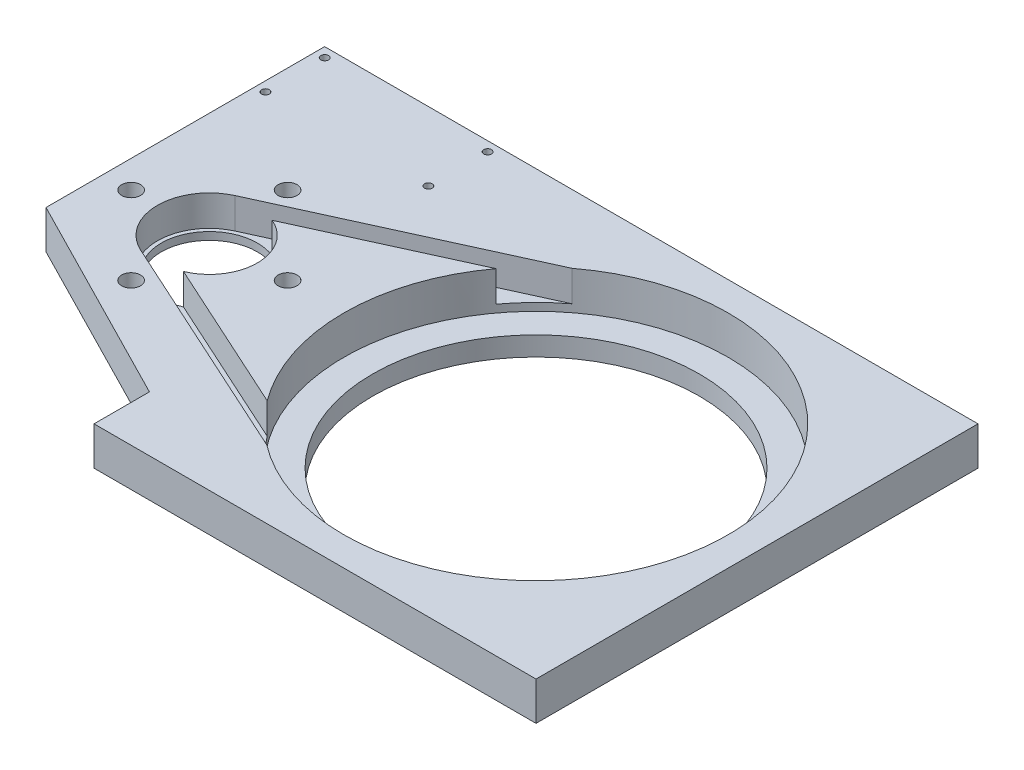
ISO-10303-21;
HEADER;
FILE_DESCRIPTION(('STEP AP214'),'2;1');
FILE_NAME('part.step','',(''),(''),'','','');
FILE_SCHEMA(('AUTOMOTIVE_DESIGN { 1 0 10303 214 1 1 1 1 }'));
ENDSEC;
DATA;
#1=APPLICATION_CONTEXT('core data for automotive mechanical design processes');
#2=APPLICATION_PROTOCOL_DEFINITION('international standard','automotive_design',2000,#1);
#3=PRODUCT_CONTEXT('',#1,'mechanical');
#4=PRODUCT('Part','Part','',(#3));
#5=PRODUCT_RELATED_PRODUCT_CATEGORY('part','',(#4));
#6=PRODUCT_DEFINITION_FORMATION('','',#4);
#7=PRODUCT_DEFINITION_CONTEXT('part definition',#1,'design');
#8=PRODUCT_DEFINITION('design','',#6,#7);
#9=PRODUCT_DEFINITION_SHAPE('','',#8);
#10=(LENGTH_UNIT() NAMED_UNIT(*) SI_UNIT(.MILLI.,.METRE.));
#11=(NAMED_UNIT(*) PLANE_ANGLE_UNIT() SI_UNIT($,.RADIAN.));
#12=(NAMED_UNIT(*) SI_UNIT($,.STERADIAN.) SOLID_ANGLE_UNIT());
#13=UNCERTAINTY_MEASURE_WITH_UNIT(LENGTH_MEASURE(1.E-05),#10,'distance_accuracy_value','');
#14=(GEOMETRIC_REPRESENTATION_CONTEXT(3) GLOBAL_UNCERTAINTY_ASSIGNED_CONTEXT((#13)) GLOBAL_UNIT_ASSIGNED_CONTEXT((#10,
#11,#12)) REPRESENTATION_CONTEXT('',''));
#15=CARTESIAN_POINT('',(0.,0.,0.));
#16=DIRECTION('',(0.,0.,1.));
#17=DIRECTION('',(1.,0.,0.));
#18=AXIS2_PLACEMENT_3D('',#15,#16,#17);
#19=CARTESIAN_POINT('',(-57.5,15.,57.5));
#20=DIRECTION('',(1.,0.,0.));
#21=DIRECTION('',(0.,0.,-1.));
#22=AXIS2_PLACEMENT_3D('',#19,#20,#21);
#23=PLANE('',#22);
#24=DIRECTION('',(0.,0.,-1.));
#25=VECTOR('',#24,1.);
#26=CARTESIAN_POINT('',(-57.5,13.,-43.0904352461679));
#27=LINE('',#26,#25);
#28=CARTESIAN_POINT('',(-57.5,13.,-43.0904352461679));
#29=VERTEX_POINT('',#28);
#30=CARTESIAN_POINT('',(-57.5,13.,-57.5));
#31=VERTEX_POINT('',#30);
#32=EDGE_CURVE('E313',#29,#31,#27,.T.);
#33=ORIENTED_EDGE('',*,*,#32,.T.);
#34=DIRECTION('',(0.,-1.,0.));
#35=VECTOR('',#34,1.);
#36=CARTESIAN_POINT('',(-57.5,15.,-57.5));
#37=LINE('',#36,#35);
#38=CARTESIAN_POINT('',(-57.5,5.,-57.5));
#39=VERTEX_POINT('',#38);
#40=EDGE_CURVE('E188',#31,#39,#37,.T.);
#41=ORIENTED_EDGE('',*,*,#40,.T.);
#42=DIRECTION('',(0.,0.,1.));
#43=VECTOR('',#42,1.);
#44=CARTESIAN_POINT('',(-57.5,5.,57.5));
#45=LINE('',#44,#43);
#46=CARTESIAN_POINT('',(-57.5,5.,-43.0904352461679));
#47=VERTEX_POINT('',#46);
#48=EDGE_CURVE('E189',#39,#47,#45,.T.);
#49=ORIENTED_EDGE('',*,*,#48,.T.);
#50=DIRECTION('',(0.,1.,0.));
#51=VECTOR('',#50,1.);
#52=CARTESIAN_POINT('',(-57.5,-97.2357199750497,-43.0904352461679));
#53=LINE('',#52,#51);
#54=EDGE_CURVE('E323',#47,#29,#53,.T.);
#55=ORIENTED_EDGE('',*,*,#54,.T.);
#56=EDGE_LOOP('',(#33,#41,#49,#55));
#57=FACE_BOUND('',#56,.T.);
#58=ADVANCED_FACE('F41',(#57),#23,.F.);
#59=CARTESIAN_POINT('',(-57.5,-97.2357199750497,-43.0904352461679));
#60=DIRECTION('',(-0.454845595302126,0.,-0.890570314143838));
#61=DIRECTION('',(-0.890570314143838,0.,0.454845595302126));
#62=AXIS2_PLACEMENT_3D('',#59,#60,#61);
#63=PLANE('',#62);
#64=DIRECTION('',(0.,1.,0.));
#65=VECTOR('',#64,1.);
#66=CARTESIAN_POINT('',(-112.5,-97.2357199750497,-15.));
#67=LINE('',#66,#65);
#68=CARTESIAN_POINT('',(-112.5,5.,-15.));
#69=VERTEX_POINT('',#68);
#70=CARTESIAN_POINT('',(-112.5,13.,-15.));
#71=VERTEX_POINT('',#70);
#72=EDGE_CURVE('E162',#69,#71,#67,.T.);
#73=ORIENTED_EDGE('',*,*,#72,.T.);
#74=DIRECTION('',(0.890570314143838,0.,-0.454845595302126));
#75=VECTOR('',#74,1.);
#76=CARTESIAN_POINT('',(-112.5,13.,-15.));
#77=LINE('',#76,#75);
#78=EDGE_CURVE('E340',#71,#29,#77,.T.);
#79=ORIENTED_EDGE('',*,*,#78,.T.);
#80=ORIENTED_EDGE('',*,*,#54,.F.);
#81=DIRECTION('',(-0.890570314143838,0.,0.454845595302126));
#82=VECTOR('',#81,1.);
#83=CARTESIAN_POINT('',(-57.5,5.,-43.0904352461679));
#84=LINE('',#83,#82);
#85=EDGE_CURVE('E166',#47,#69,#84,.T.);
#86=ORIENTED_EDGE('',*,*,#85,.T.);
#87=EDGE_LOOP('',(#73,#79,#80,#86));
#88=FACE_BOUND('',#87,.T.);
#89=ADVANCED_FACE('F339',(#88),#63,.T.);
#90=CARTESIAN_POINT('',(0.,15.,0.));
#91=DIRECTION('',(0.,-1.,0.));
#92=DIRECTION('',(0.,0.,-1.));
#93=AXIS2_PLACEMENT_3D('',#90,#91,#92);
#94=PLANE('',#93);
#95=CARTESIAN_POINT('',(0.,15.,0.));
#96=DIRECTION('',(0.,1.,0.));
#97=DIRECTION('',(0.,0.,1.));
#98=AXIS2_PLACEMENT_3D('',#95,#96,#97);
#99=CIRCLE('',#98,50.);
#100=CARTESIAN_POINT('',(-40.1698982158662,15.,-29.7721224860934));
#101=VERTEX_POINT('',#100);
#102=CARTESIAN_POINT('',(-40.1698982158662,15.,29.7721224860934));
#103=VERTEX_POINT('',#102);
#104=EDGE_CURVE('E161',#101,#103,#99,.T.);
#105=ORIENTED_EDGE('',*,*,#104,.F.);
#106=DIRECTION('',(0.909955510528877,0.,-0.414705882352941));
#107=VECTOR('',#106,1.);
#108=CARTESIAN_POINT('',(-18.1433823529412,15.,-39.8105535856384));
#109=LINE('',#108,#107);
#110=CARTESIAN_POINT('',(-80.1851199879185,15.,-11.5354640335471));
#111=VERTEX_POINT('',#110);
#112=EDGE_CURVE('E402',#111,#101,#109,.T.);
#113=ORIENTED_EDGE('',*,*,#112,.F.);
#114=CARTESIAN_POINT('',(-85.,15.,0.));
#115=DIRECTION('',(0.,1.,0.));
#116=DIRECTION('',(0.,0.,1.));
#117=AXIS2_PLACEMENT_3D('',#114,#115,#116);
#118=CIRCLE('',#117,12.5);
#119=CARTESIAN_POINT('',(-80.1851199879185,15.,11.5354640335471));
#120=VERTEX_POINT('',#119);
#121=EDGE_CURVE('E362',#120,#111,#118,.T.);
#122=ORIENTED_EDGE('',*,*,#121,.F.);
#123=DIRECTION('',(-0.909955510528877,0.,-0.414705882352941));
#124=VECTOR('',#123,1.);
#125=CARTESIAN_POINT('',(-18.1433823529412,15.,39.8105535856384));
#126=LINE('',#125,#124);
#127=EDGE_CURVE('E405',#103,#120,#126,.T.);
#128=ORIENTED_EDGE('',*,*,#127,.F.);
#129=EDGE_LOOP('',(#105,#113,#122,#128));
#130=FACE_BOUND('',#129,.T.);
#131=CARTESIAN_POINT('',(-64.6423957696393,15.,0.));
#132=DIRECTION('',(0.,-1.,0.));
#133=DIRECTION('',(0.,0.,-1.));
#134=AXIS2_PLACEMENT_3D('',#131,#132,#133);
#135=CIRCLE('',#134,2.45745);
#136=CARTESIAN_POINT('',(-64.6423957696393,15.,-2.45745));
#137=VERTEX_POINT('',#136);
#138=EDGE_CURVE('E383',#137,#137,#135,.T.);
#139=ORIENTED_EDGE('',*,*,#138,.T.);
#140=EDGE_LOOP('',(#139));
#141=FACE_BOUND('',#140,.T.);
#142=ADVANCED_FACE('F463',(#130,#141),#94,.F.);
#143=DIRECTION('',(0.,1.,0.));
#144=VECTOR('',#143,1.);
#145=CARTESIAN_POINT('',(-57.5,-97.2357199750497,43.0904352461679));
#146=LINE('',#145,#144);
#147=CARTESIAN_POINT('',(-57.5,5.,43.0904352461679));
#148=VERTEX_POINT('',#147);
#149=CARTESIAN_POINT('',(-57.5,15.,43.0904352461679));
#150=VERTEX_POINT('',#149);
#151=EDGE_CURVE('E341',#148,#150,#146,.T.);
#152=ORIENTED_EDGE('',*,*,#151,.F.);
#153=CARTESIAN_POINT('',(-57.5,5.,57.5));
#154=VERTEX_POINT('',#153);
#155=EDGE_CURVE('E174',#148,#154,#45,.T.);
#156=ORIENTED_EDGE('',*,*,#155,.T.);
#157=DIRECTION('',(0.,-1.,0.));
#158=VECTOR('',#157,1.);
#159=CARTESIAN_POINT('',(-57.5,15.,57.5));
#160=LINE('',#159,#158);
#161=CARTESIAN_POINT('',(-57.5,15.,57.5));
#162=VERTEX_POINT('',#161);
#163=EDGE_CURVE('E208',#162,#154,#160,.T.);
#164=ORIENTED_EDGE('',*,*,#163,.F.);
#165=DIRECTION('',(0.,0.,1.));
#166=VECTOR('',#165,1.);
#167=CARTESIAN_POINT('',(-57.5,15.,57.5));
#168=LINE('',#167,#166);
#169=EDGE_CURVE('E175',#150,#162,#168,.T.);
#170=ORIENTED_EDGE('',*,*,#169,.F.);
#171=EDGE_LOOP('',(#152,#156,#164,#170));
#172=FACE_BOUND('',#171,.T.);
#173=ADVANCED_FACE('F486',(#172),#23,.F.);
#174=CARTESIAN_POINT('',(-52.5,5.,52.5));
#175=DIRECTION('',(-1.,0.,0.));
#176=DIRECTION('',(0.,0.,1.));
#177=AXIS2_PLACEMENT_3D('',#174,#175,#176);
#178=PLANE('',#177);
#179=DIRECTION('',(0.,0.,-1.));
#180=VECTOR('',#179,1.);
#181=CARTESIAN_POINT('',(-52.5,0.,52.5));
#182=LINE('',#181,#180);
#183=CARTESIAN_POINT('',(-52.5,0.,52.5));
#184=VERTEX_POINT('',#183);
#185=CARTESIAN_POINT('',(-52.5,0.,-52.5));
#186=VERTEX_POINT('',#185);
#187=EDGE_CURVE('E108',#184,#186,#182,.T.);
#188=ORIENTED_EDGE('',*,*,#187,.F.);
#189=DIRECTION('',(0.,-1.,0.));
#190=VECTOR('',#189,1.);
#191=CARTESIAN_POINT('',(-52.5,5.,52.5));
#192=LINE('',#191,#190);
#193=CARTESIAN_POINT('',(-52.5,5.,52.5));
#194=VERTEX_POINT('',#193);
#195=EDGE_CURVE('E90',#194,#184,#192,.T.);
#196=ORIENTED_EDGE('',*,*,#195,.F.);
#197=DIRECTION('',(0.,0.,-1.));
#198=VECTOR('',#197,1.);
#199=CARTESIAN_POINT('',(-52.5,5.,52.5));
#200=LINE('',#199,#198);
#201=CARTESIAN_POINT('',(-52.5,5.,-52.5));
#202=VERTEX_POINT('',#201);
#203=EDGE_CURVE('E95',#194,#202,#200,.T.);
#204=ORIENTED_EDGE('',*,*,#203,.T.);
#205=DIRECTION('',(0.,-1.,0.));
#206=VECTOR('',#205,1.);
#207=CARTESIAN_POINT('',(-52.5,5.,-52.5));
#208=LINE('',#207,#206);
#209=EDGE_CURVE('E115',#202,#186,#208,.T.);
#210=ORIENTED_EDGE('',*,*,#209,.T.);
#211=EDGE_LOOP('',(#188,#196,#204,#210));
#212=FACE_BOUND('',#211,.T.);
#213=ADVANCED_FACE('F43',(#212),#178,.T.);
#214=CARTESIAN_POINT('',(-52.5,5.,52.5));
#215=DIRECTION('',(0.,0.,-1.));
#216=DIRECTION('',(-1.,0.,0.));
#217=AXIS2_PLACEMENT_3D('',#214,#215,#216);
#218=PLANE('',#217);
#219=DIRECTION('',(1.,0.,0.));
#220=VECTOR('',#219,1.);
#221=CARTESIAN_POINT('',(-52.5,0.,52.5));
#222=LINE('',#221,#220);
#223=CARTESIAN_POINT('',(52.5,0.,52.5));
#224=VERTEX_POINT('',#223);
#225=EDGE_CURVE('E83',#184,#224,#222,.T.);
#226=ORIENTED_EDGE('',*,*,#225,.T.);
#227=DIRECTION('',(0.,-1.,0.));
#228=VECTOR('',#227,1.);
#229=CARTESIAN_POINT('',(52.5,5.,52.5));
#230=LINE('',#229,#228);
#231=CARTESIAN_POINT('',(52.5,5.,52.5));
#232=VERTEX_POINT('',#231);
#233=EDGE_CURVE('E88',#232,#224,#230,.T.);
#234=ORIENTED_EDGE('',*,*,#233,.F.);
#235=DIRECTION('',(1.,0.,0.));
#236=VECTOR('',#235,1.);
#237=CARTESIAN_POINT('',(-52.5,5.,52.5));
#238=LINE('',#237,#236);
#239=EDGE_CURVE('E117',#194,#232,#238,.T.);
#240=ORIENTED_EDGE('',*,*,#239,.F.);
#241=ORIENTED_EDGE('',*,*,#195,.T.);
#242=EDGE_LOOP('',(#226,#234,#240,#241));
#243=FACE_BOUND('',#242,.T.);
#244=ADVANCED_FACE('F85',(#243),#218,.F.);
#245=CARTESIAN_POINT('',(52.5,5.,52.5));
#246=DIRECTION('',(-1.,0.,0.));
#247=DIRECTION('',(0.,0.,1.));
#248=AXIS2_PLACEMENT_3D('',#245,#246,#247);
#249=PLANE('',#248);
#250=DIRECTION('',(0.,0.,-1.));
#251=VECTOR('',#250,1.);
#252=CARTESIAN_POINT('',(52.5,0.,52.5));
#253=LINE('',#252,#251);
#254=CARTESIAN_POINT('',(52.5,0.,-52.5));
#255=VERTEX_POINT('',#254);
#256=EDGE_CURVE('E96',#224,#255,#253,.T.);
#257=ORIENTED_EDGE('',*,*,#256,.T.);
#258=DIRECTION('',(0.,-1.,0.));
#259=VECTOR('',#258,1.);
#260=CARTESIAN_POINT('',(52.5,5.,-52.5));
#261=LINE('',#260,#259);
#262=CARTESIAN_POINT('',(52.5,5.,-52.5));
#263=VERTEX_POINT('',#262);
#264=EDGE_CURVE('E102',#263,#255,#261,.T.);
#265=ORIENTED_EDGE('',*,*,#264,.F.);
#266=DIRECTION('',(0.,0.,-1.));
#267=VECTOR('',#266,1.);
#268=CARTESIAN_POINT('',(52.5,5.,52.5));
#269=LINE('',#268,#267);
#270=EDGE_CURVE('E65',#232,#263,#269,.T.);
#271=ORIENTED_EDGE('',*,*,#270,.F.);
#272=ORIENTED_EDGE('',*,*,#233,.T.);
#273=EDGE_LOOP('',(#257,#265,#271,#272));
#274=FACE_BOUND('',#273,.T.);
#275=ADVANCED_FACE('F100',(#274),#249,.F.);
#276=CARTESIAN_POINT('',(-52.5,5.,-52.5));
#277=DIRECTION('',(0.,0.,-1.));
#278=DIRECTION('',(-1.,0.,0.));
#279=AXIS2_PLACEMENT_3D('',#276,#277,#278);
#280=PLANE('',#279);
#281=DIRECTION('',(1.,0.,0.));
#282=VECTOR('',#281,1.);
#283=CARTESIAN_POINT('',(-52.5,0.,-52.5));
#284=LINE('',#283,#282);
#285=EDGE_CURVE('E106',#186,#255,#284,.T.);
#286=ORIENTED_EDGE('',*,*,#285,.F.);
#287=ORIENTED_EDGE('',*,*,#209,.F.);
#288=DIRECTION('',(1.,0.,0.));
#289=VECTOR('',#288,1.);
#290=CARTESIAN_POINT('',(-52.5,5.,-52.5));
#291=LINE('',#290,#289);
#292=EDGE_CURVE('E213',#202,#263,#291,.T.);
#293=ORIENTED_EDGE('',*,*,#292,.T.);
#294=ORIENTED_EDGE('',*,*,#264,.T.);
#295=EDGE_LOOP('',(#286,#287,#293,#294));
#296=FACE_BOUND('',#295,.T.);
#297=ADVANCED_FACE('F222',(#296),#280,.T.);
#298=CARTESIAN_POINT('',(0.,0.,0.));
#299=DIRECTION('',(0.,-1.,0.));
#300=DIRECTION('',(0.,0.,-1.));
#301=AXIS2_PLACEMENT_3D('',#298,#299,#300);
#302=PLANE('',#301);
#303=CARTESIAN_POINT('',(0.,0.,0.));
#304=DIRECTION('',(0.,1.,0.));
#305=DIRECTION('',(0.,0.,1.));
#306=AXIS2_PLACEMENT_3D('',#303,#304,#305);
#307=CIRCLE('',#306,42.5);
#308=CARTESIAN_POINT('',(0.,0.,42.5));
#309=VERTEX_POINT('',#308);
#310=EDGE_CURVE('E121',#309,#309,#307,.T.);
#311=ORIENTED_EDGE('',*,*,#310,.T.);
#312=EDGE_LOOP('',(#311));
#313=FACE_BOUND('',#312,.T.);
#314=ORIENTED_EDGE('',*,*,#187,.T.);
#315=ORIENTED_EDGE('',*,*,#285,.T.);
#316=ORIENTED_EDGE('',*,*,#256,.F.);
#317=ORIENTED_EDGE('',*,*,#225,.F.);
#318=EDGE_LOOP('',(#314,#315,#316,#317));
#319=FACE_BOUND('',#318,.T.);
#320=ADVANCED_FACE('F104',(#313,#319),#302,.T.);
#321=CARTESIAN_POINT('',(0.,5.,0.));
#322=DIRECTION('',(0.,-1.,0.));
#323=DIRECTION('',(0.,0.,-1.));
#324=AXIS2_PLACEMENT_3D('',#321,#322,#323);
#325=PLANE('',#324);
#326=CARTESIAN_POINT('',(-64.6423957696393,5.,0.));
#327=DIRECTION('',(0.,-1.,0.));
#328=DIRECTION('',(0.,0.,-1.));
#329=AXIS2_PLACEMENT_3D('',#326,#327,#328);
#330=CIRCLE('',#329,2.45745);
#331=CARTESIAN_POINT('',(-64.6423957696393,5.,-2.45745));
#332=VERTEX_POINT('',#331);
#333=EDGE_CURVE('E386',#332,#332,#330,.T.);
#334=ORIENTED_EDGE('',*,*,#333,.F.);
#335=EDGE_LOOP('',(#334));
#336=FACE_BOUND('',#335,.T.);
#337=CARTESIAN_POINT('',(-85.,5.,20.3576042303607));
#338=DIRECTION('',(0.,-1.,0.));
#339=DIRECTION('',(0.,0.,-1.));
#340=AXIS2_PLACEMENT_3D('',#337,#338,#339);
#341=CIRCLE('',#340,2.45745);
#342=CARTESIAN_POINT('',(-85.,5.,17.9001542303607));
#343=VERTEX_POINT('',#342);
#344=EDGE_CURVE('E380',#343,#343,#341,.T.);
#345=ORIENTED_EDGE('',*,*,#344,.F.);
#346=EDGE_LOOP('',(#345));
#347=FACE_BOUND('',#346,.T.);
#348=CARTESIAN_POINT('',(-105.357604230361,5.,0.));
#349=DIRECTION('',(0.,-1.,0.));
#350=DIRECTION('',(0.,0.,-1.));
#351=AXIS2_PLACEMENT_3D('',#348,#349,#350);
#352=CIRCLE('',#351,2.45745);
#353=CARTESIAN_POINT('',(-105.357604230361,5.,-2.45745000000001));
#354=VERTEX_POINT('',#353);
#355=EDGE_CURVE('E374',#354,#354,#352,.T.);
#356=ORIENTED_EDGE('',*,*,#355,.F.);
#357=EDGE_LOOP('',(#356));
#358=FACE_BOUND('',#357,.T.);
#359=CARTESIAN_POINT('',(-85.,5.,-20.3576042303607));
#360=DIRECTION('',(0.,-1.,0.));
#361=DIRECTION('',(0.,0.,-1.));
#362=AXIS2_PLACEMENT_3D('',#359,#360,#361);
#363=CIRCLE('',#362,2.45745);
#364=CARTESIAN_POINT('',(-85.,5.,-22.8150542303607));
#365=VERTEX_POINT('',#364);
#366=EDGE_CURVE('E368',#365,#365,#363,.T.);
#367=ORIENTED_EDGE('',*,*,#366,.F.);
#368=EDGE_LOOP('',(#367));
#369=FACE_BOUND('',#368,.T.);
#370=CARTESIAN_POINT('',(-85.,5.,0.));
#371=DIRECTION('',(0.,-1.,0.));
#372=DIRECTION('',(0.,0.,-1.));
#373=AXIS2_PLACEMENT_3D('',#370,#371,#372);
#374=CIRCLE('',#373,12.5);
#375=CARTESIAN_POINT('',(-85.,5.,-12.5));
#376=VERTEX_POINT('',#375);
#377=EDGE_CURVE('E358',#376,#376,#374,.T.);
#378=ORIENTED_EDGE('',*,*,#377,.F.);
#379=EDGE_LOOP('',(#378));
#380=FACE_BOUND('',#379,.T.);
#381=ORIENTED_EDGE('',*,*,#48,.F.);
#382=DIRECTION('',(-1.,0.,0.));
#383=VECTOR('',#382,1.);
#384=CARTESIAN_POINT('',(-57.5,5.,-57.5));
#385=LINE('',#384,#383);
#386=CARTESIAN_POINT('',(57.5,5.,-57.5));
#387=VERTEX_POINT('',#386);
#388=EDGE_CURVE('E179',#387,#39,#385,.T.);
#389=ORIENTED_EDGE('',*,*,#388,.F.);
#390=DIRECTION('',(0.,0.,-1.));
#391=VECTOR('',#390,1.);
#392=CARTESIAN_POINT('',(57.5,5.,57.5));
#393=LINE('',#392,#391);
#394=CARTESIAN_POINT('',(57.5,5.,57.5));
#395=VERTEX_POINT('',#394);
#396=EDGE_CURVE('E195',#395,#387,#393,.T.);
#397=ORIENTED_EDGE('',*,*,#396,.F.);
#398=DIRECTION('',(1.,0.,0.));
#399=VECTOR('',#398,1.);
#400=CARTESIAN_POINT('',(-57.5,5.,57.5));
#401=LINE('',#400,#399);
#402=EDGE_CURVE('E192',#154,#395,#401,.T.);
#403=ORIENTED_EDGE('',*,*,#402,.F.);
#404=ORIENTED_EDGE('',*,*,#155,.F.);
#405=DIRECTION('',(0.890570314143838,0.,0.454845595302126));
#406=VECTOR('',#405,1.);
#407=CARTESIAN_POINT('',(-112.5,5.,15.));
#408=LINE('',#407,#406);
#409=CARTESIAN_POINT('',(-112.5,5.,15.));
#410=VERTEX_POINT('',#409);
#411=EDGE_CURVE('E343',#410,#148,#408,.T.);
#412=ORIENTED_EDGE('',*,*,#411,.F.);
#413=DIRECTION('',(0.,0.,1.));
#414=VECTOR('',#413,1.);
#415=CARTESIAN_POINT('',(-112.5,5.,-15.));
#416=LINE('',#415,#414);
#417=EDGE_CURVE('E335',#69,#410,#416,.T.);
#418=ORIENTED_EDGE('',*,*,#417,.F.);
#419=ORIENTED_EDGE('',*,*,#85,.F.);
#420=EDGE_LOOP('',(#381,#389,#397,#403,#404,#412,#418,#419));
#421=FACE_BOUND('',#420,.T.);
#422=ORIENTED_EDGE('',*,*,#203,.F.);
#423=ORIENTED_EDGE('',*,*,#239,.T.);
#424=ORIENTED_EDGE('',*,*,#270,.T.);
#425=ORIENTED_EDGE('',*,*,#292,.F.);
#426=EDGE_LOOP('',(#422,#423,#424,#425));
#427=FACE_BOUND('',#426,.T.);
#428=ADVANCED_FACE('F223',(#336,#347,#358,#369,#380,#421,#427),#325,.T.);
#429=CARTESIAN_POINT('',(-57.5,15.,57.5));
#430=DIRECTION('',(0.,0.,-1.));
#431=DIRECTION('',(-1.,0.,0.));
#432=AXIS2_PLACEMENT_3D('',#429,#430,#431);
#433=PLANE('',#432);
#434=ORIENTED_EDGE('',*,*,#402,.T.);
#435=DIRECTION('',(0.,-1.,0.));
#436=VECTOR('',#435,1.);
#437=CARTESIAN_POINT('',(57.5,15.,57.5));
#438=LINE('',#437,#436);
#439=CARTESIAN_POINT('',(57.5,15.,57.5));
#440=VERTEX_POINT('',#439);
#441=EDGE_CURVE('E205',#440,#395,#438,.T.);
#442=ORIENTED_EDGE('',*,*,#441,.F.);
#443=DIRECTION('',(1.,0.,0.));
#444=VECTOR('',#443,1.);
#445=CARTESIAN_POINT('',(-57.5,15.,57.5));
#446=LINE('',#445,#444);
#447=EDGE_CURVE('E178',#162,#440,#446,.T.);
#448=ORIENTED_EDGE('',*,*,#447,.F.);
#449=ORIENTED_EDGE('',*,*,#163,.T.);
#450=EDGE_LOOP('',(#434,#442,#448,#449));
#451=FACE_BOUND('',#450,.T.);
#452=ADVANCED_FACE('F513',(#451),#433,.F.);
#453=CARTESIAN_POINT('',(57.5,15.,57.5));
#454=DIRECTION('',(-1.,0.,0.));
#455=DIRECTION('',(0.,0.,1.));
#456=AXIS2_PLACEMENT_3D('',#453,#454,#455);
#457=PLANE('',#456);
#458=ORIENTED_EDGE('',*,*,#396,.T.);
#459=DIRECTION('',(0.,-1.,0.));
#460=VECTOR('',#459,1.);
#461=CARTESIAN_POINT('',(57.5,15.,-57.5));
#462=LINE('',#461,#460);
#463=CARTESIAN_POINT('',(57.5,15.,-57.5));
#464=VERTEX_POINT('',#463);
#465=EDGE_CURVE('E202',#464,#387,#462,.T.);
#466=ORIENTED_EDGE('',*,*,#465,.F.);
#467=DIRECTION('',(0.,0.,-1.));
#468=VECTOR('',#467,1.);
#469=CARTESIAN_POINT('',(57.5,15.,57.5));
#470=LINE('',#469,#468);
#471=EDGE_CURVE('E182',#440,#464,#470,.T.);
#472=ORIENTED_EDGE('',*,*,#471,.F.);
#473=ORIENTED_EDGE('',*,*,#441,.T.);
#474=EDGE_LOOP('',(#458,#466,#472,#473));
#475=FACE_BOUND('',#474,.T.);
#476=ADVANCED_FACE('F542',(#475),#457,.F.);
#477=CARTESIAN_POINT('',(-57.5,15.,-57.5));
#478=DIRECTION('',(0.,0.,1.));
#479=DIRECTION('',(1.,0.,0.));
#480=AXIS2_PLACEMENT_3D('',#477,#478,#479);
#481=PLANE('',#480);
#482=ORIENTED_EDGE('',*,*,#388,.T.);
#483=ORIENTED_EDGE('',*,*,#40,.F.);
#484=DIRECTION('',(-1.,0.,0.));
#485=VECTOR('',#484,1.);
#486=CARTESIAN_POINT('',(-57.5,13.,-57.5));
#487=LINE('',#486,#485);
#488=CARTESIAN_POINT('',(-112.5,13.,-57.5));
#489=VERTEX_POINT('',#488);
#490=EDGE_CURVE('E309',#31,#489,#487,.T.);
#491=ORIENTED_EDGE('',*,*,#490,.T.);
#492=DIRECTION('',(0.,1.,0.));
#493=VECTOR('',#492,1.);
#494=CARTESIAN_POINT('',(-112.5,13.,-57.5));
#495=LINE('',#494,#493);
#496=CARTESIAN_POINT('',(-112.5,15.,-57.5));
#497=VERTEX_POINT('',#496);
#498=EDGE_CURVE('E412',#489,#497,#495,.T.);
#499=ORIENTED_EDGE('',*,*,#498,.T.);
#500=DIRECTION('',(-1.,0.,0.));
#501=VECTOR('',#500,1.);
#502=CARTESIAN_POINT('',(-57.5,15.,-57.5));
#503=LINE('',#502,#501);
#504=EDGE_CURVE('E185',#464,#497,#503,.T.);
#505=ORIENTED_EDGE('',*,*,#504,.F.);
#506=ORIENTED_EDGE('',*,*,#465,.T.);
#507=EDGE_LOOP('',(#482,#483,#491,#499,#505,#506));
#508=FACE_BOUND('',#507,.T.);
#509=ADVANCED_FACE('F326',(#508),#481,.F.);
#510=CARTESIAN_POINT('',(-85.,15.,20.3576042303607));
#511=DIRECTION('',(0.,-1.,0.));
#512=DIRECTION('',(0.,0.,-1.));
#513=AXIS2_PLACEMENT_3D('',#510,#511,#512);
#514=CIRCLE('',#513,2.45745);
#515=CARTESIAN_POINT('',(-85.,15.,17.9001542303607));
#516=VERTEX_POINT('',#515);
#517=EDGE_CURVE('E377',#516,#516,#514,.T.);
#518=ORIENTED_EDGE('',*,*,#517,.T.);
#519=EDGE_LOOP('',(#518));
#520=FACE_BOUND('',#519,.T.);
#521=CARTESIAN_POINT('',(-105.357604230361,15.,0.));
#522=DIRECTION('',(0.,-1.,0.));
#523=DIRECTION('',(0.,0.,-1.));
#524=AXIS2_PLACEMENT_3D('',#521,#522,#523);
#525=CIRCLE('',#524,2.45745);
#526=CARTESIAN_POINT('',(-105.357604230361,15.,-2.45745000000001));
#527=VERTEX_POINT('',#526);
#528=EDGE_CURVE('E371',#527,#527,#525,.T.);
#529=ORIENTED_EDGE('',*,*,#528,.T.);
#530=EDGE_LOOP('',(#529));
#531=FACE_BOUND('',#530,.T.);
#532=CARTESIAN_POINT('',(-85.,15.,-20.3576042303607));
#533=DIRECTION('',(0.,-1.,0.));
#534=DIRECTION('',(0.,0.,-1.));
#535=AXIS2_PLACEMENT_3D('',#532,#533,#534);
#536=CIRCLE('',#535,2.45745);
#537=CARTESIAN_POINT('',(-85.,15.,-22.8150542303607));
#538=VERTEX_POINT('',#537);
#539=EDGE_CURVE('E365',#538,#538,#536,.T.);
#540=ORIENTED_EDGE('',*,*,#539,.T.);
#541=EDGE_LOOP('',(#540));
#542=FACE_BOUND('',#541,.T.);
#543=CARTESIAN_POINT('',(-30.3267386255663,15.,39.752848002836));
#544=VERTEX_POINT('',#543);
#545=CARTESIAN_POINT('',(-30.3267386255663,15.,-39.7528480028361));
#546=VERTEX_POINT('',#545);
#547=EDGE_CURVE('E141',#544,#546,#99,.T.);
#548=ORIENTED_EDGE('',*,*,#547,.F.);
#549=DIRECTION('',(0.909955510528877,0.,0.414705882352941));
#550=VECTOR('',#549,1.);
#551=CARTESIAN_POINT('',(-20.2169117647059,15.,44.3603311382827));
#552=LINE('',#551,#550);
#553=CARTESIAN_POINT('',(-90.5985294117647,15.,12.2843993921398));
#554=VERTEX_POINT('',#553);
#555=EDGE_CURVE('E158',#554,#544,#552,.T.);
#556=ORIENTED_EDGE('',*,*,#555,.F.);
#557=CARTESIAN_POINT('',(-85.,15.,0.));
#558=DIRECTION('',(0.,1.,0.));
#559=DIRECTION('',(0.,0.,-1.));
#560=AXIS2_PLACEMENT_3D('',#557,#558,#559);
#561=CIRCLE('',#560,13.5);
#562=CARTESIAN_POINT('',(-90.5985294117647,15.,-12.2843993921398));
#563=VERTEX_POINT('',#562);
#564=EDGE_CURVE('E408',#563,#554,#561,.T.);
#565=ORIENTED_EDGE('',*,*,#564,.F.);
#566=DIRECTION('',(-0.909955510528877,0.,0.414705882352941));
#567=VECTOR('',#566,1.);
#568=CARTESIAN_POINT('',(-20.2169117647059,15.,-44.3603311382827));
#569=LINE('',#568,#567);
#570=EDGE_CURVE('E160',#546,#563,#569,.T.);
#571=ORIENTED_EDGE('',*,*,#570,.F.);
#572=EDGE_LOOP('',(#548,#556,#565,#571));
#573=FACE_BOUND('',#572,.T.);
#574=ORIENTED_EDGE('',*,*,#504,.T.);
#575=DIRECTION('',(0.,0.,1.));
#576=VECTOR('',#575,1.);
#577=CARTESIAN_POINT('',(-112.5,15.,-15.));
#578=LINE('',#577,#576);
#579=CARTESIAN_POINT('',(-112.5,15.,15.));
#580=VERTEX_POINT('',#579);
#581=EDGE_CURVE('E354',#497,#580,#578,.T.);
#582=ORIENTED_EDGE('',*,*,#581,.T.);
#583=DIRECTION('',(0.890570314143838,0.,0.454845595302126));
#584=VECTOR('',#583,1.);
#585=CARTESIAN_POINT('',(-112.5,15.,15.));
#586=LINE('',#585,#584);
#587=EDGE_CURVE('E351',#580,#150,#586,.T.);
#588=ORIENTED_EDGE('',*,*,#587,.T.);
#589=ORIENTED_EDGE('',*,*,#169,.T.);
#590=ORIENTED_EDGE('',*,*,#447,.T.);
#591=ORIENTED_EDGE('',*,*,#471,.T.);
#592=EDGE_LOOP('',(#574,#582,#588,#589,#590,#591));
#593=FACE_BOUND('',#592,.T.);
#594=CARTESIAN_POINT('',(-110.,15.,-39.6));
#595=DIRECTION('',(0.,1.,0.));
#596=DIRECTION('',(0.,0.,1.));
#597=AXIS2_PLACEMENT_3D('',#594,#595,#596);
#598=CIRCLE('',#597,0.999999999999998);
#599=CARTESIAN_POINT('',(-110.,15.,-38.6));
#600=VERTEX_POINT('',#599);
#601=EDGE_CURVE('E443',#600,#600,#598,.T.);
#602=ORIENTED_EDGE('',*,*,#601,.F.);
#603=EDGE_LOOP('',(#602));
#604=FACE_BOUND('',#603,.T.);
#605=CARTESIAN_POINT('',(-110.,15.,-55.));
#606=DIRECTION('',(0.,1.,0.));
#607=DIRECTION('',(0.,0.,1.));
#608=AXIS2_PLACEMENT_3D('',#605,#606,#607);
#609=CIRCLE('',#608,0.999999999999998);
#610=CARTESIAN_POINT('',(-110.,15.,-54.));
#611=VERTEX_POINT('',#610);
#612=EDGE_CURVE('E437',#611,#611,#609,.T.);
#613=ORIENTED_EDGE('',*,*,#612,.F.);
#614=EDGE_LOOP('',(#613));
#615=FACE_BOUND('',#614,.T.);
#616=CARTESIAN_POINT('',(-67.6,15.,-39.6));
#617=DIRECTION('',(0.,1.,0.));
#618=DIRECTION('',(0.,0.,1.));
#619=AXIS2_PLACEMENT_3D('',#616,#617,#618);
#620=CIRCLE('',#619,0.999999999999998);
#621=CARTESIAN_POINT('',(-67.6,15.,-38.6));
#622=VERTEX_POINT('',#621);
#623=EDGE_CURVE('E431',#622,#622,#620,.T.);
#624=ORIENTED_EDGE('',*,*,#623,.F.);
#625=EDGE_LOOP('',(#624));
#626=FACE_BOUND('',#625,.T.);
#627=CARTESIAN_POINT('',(-67.6,15.,-55.));
#628=DIRECTION('',(0.,1.,0.));
#629=DIRECTION('',(0.,0.,1.));
#630=AXIS2_PLACEMENT_3D('',#627,#628,#629);
#631=CIRCLE('',#630,0.999999999999998);
#632=CARTESIAN_POINT('',(-67.6,15.,-54.));
#633=VERTEX_POINT('',#632);
#634=EDGE_CURVE('E425',#633,#633,#631,.T.);
#635=ORIENTED_EDGE('',*,*,#634,.F.);
#636=EDGE_LOOP('',(#635));
#637=FACE_BOUND('',#636,.T.);
#638=ADVANCED_FACE('F154',(#520,#531,#542,#573,#593,#604,#615,#626,#637),#94,.F.);
#639=CARTESIAN_POINT('',(0.,0.,0.));
#640=DIRECTION('',(0.,1.,0.));
#641=DIRECTION('',(0.,0.,1.));
#642=AXIS2_PLACEMENT_3D('',#639,#640,#641);
#643=CYLINDRICAL_SURFACE('',#642,42.5);
#644=CARTESIAN_POINT('',(0.,5.,0.));
#645=DIRECTION('',(0.,-1.,0.));
#646=DIRECTION('',(0.,0.,-1.));
#647=AXIS2_PLACEMENT_3D('',#644,#645,#646);
#648=CIRCLE('',#647,42.5);
#649=CARTESIAN_POINT('',(0.,5.,-42.5));
#650=VERTEX_POINT('',#649);
#651=EDGE_CURVE('E118',#650,#650,#648,.F.);
#652=ORIENTED_EDGE('',*,*,#651,.T.);
#653=EDGE_LOOP('',(#652));
#654=FACE_BOUND('',#653,.T.);
#655=ORIENTED_EDGE('',*,*,#310,.F.);
#656=EDGE_LOOP('',(#655));
#657=FACE_BOUND('',#656,.T.);
#658=ADVANCED_FACE('F460',(#654,#657),#643,.F.);
#659=CARTESIAN_POINT('',(0.,5.,0.));
#660=DIRECTION('',(0.,-1.,0.));
#661=DIRECTION('',(0.,0.,-1.));
#662=AXIS2_PLACEMENT_3D('',#659,#660,#661);
#663=PLANE('',#662);
#664=CARTESIAN_POINT('',(0.,5.,0.));
#665=DIRECTION('',(0.,-1.,0.));
#666=DIRECTION('',(0.,0.,-1.));
#667=AXIS2_PLACEMENT_3D('',#664,#665,#666);
#668=CIRCLE('',#667,50.);
#669=CARTESIAN_POINT('',(0.,5.,-50.));
#670=VERTEX_POINT('',#669);
#671=EDGE_CURVE('E122',#670,#670,#668,.F.);
#672=ORIENTED_EDGE('',*,*,#671,.T.);
#673=EDGE_LOOP('',(#672));
#674=FACE_BOUND('',#673,.T.);
#675=ORIENTED_EDGE('',*,*,#651,.F.);
#676=EDGE_LOOP('',(#675));
#677=FACE_BOUND('',#676,.T.);
#678=ADVANCED_FACE('F530',(#674,#677),#663,.F.);
#679=CARTESIAN_POINT('',(0.,-141.42135623731,0.));
#680=DIRECTION('',(0.,1.,0.));
#681=DIRECTION('',(0.,0.,1.));
#682=AXIS2_PLACEMENT_3D('',#679,#680,#681);
#683=CYLINDRICAL_SURFACE('',#682,50.);
#684=CARTESIAN_POINT('',(0.,7.00000000000001,0.));
#685=DIRECTION('',(0.,-1.,0.));
#686=DIRECTION('',(0.,0.,-1.));
#687=AXIS2_PLACEMENT_3D('',#684,#685,#686);
#688=CIRCLE('',#687,50.);
#689=CARTESIAN_POINT('',(-30.3267386255663,7.00000000000001,-39.7528480028361));
#690=VERTEX_POINT('',#689);
#691=CARTESIAN_POINT('',(-40.1698982158662,7.00000000000001,-29.7721224860934));
#692=VERTEX_POINT('',#691);
#693=EDGE_CURVE('E394',#690,#692,#688,.F.);
#694=ORIENTED_EDGE('',*,*,#693,.T.);
#695=DIRECTION('',(0.,1.,0.));
#696=VECTOR('',#695,1.);
#697=CARTESIAN_POINT('',(-40.1698982158662,-141.42135623731,-29.7721224860934));
#698=LINE('',#697,#696);
#699=EDGE_CURVE('E389',#692,#101,#698,.T.);
#700=ORIENTED_EDGE('',*,*,#699,.T.);
#701=ORIENTED_EDGE('',*,*,#104,.T.);
#702=DIRECTION('',(0.,1.,0.));
#703=VECTOR('',#702,1.);
#704=CARTESIAN_POINT('',(-40.1698982158662,-141.42135623731,29.7721224860934));
#705=LINE('',#704,#703);
#706=CARTESIAN_POINT('',(-40.1698982158662,7.00000000000001,29.7721224860934));
#707=VERTEX_POINT('',#706);
#708=EDGE_CURVE('E392',#103,#707,#705,.F.);
#709=ORIENTED_EDGE('',*,*,#708,.T.);
#710=CARTESIAN_POINT('',(-30.3267386255663,7.00000000000001,39.752848002836));
#711=VERTEX_POINT('',#710);
#712=EDGE_CURVE('E144',#707,#711,#688,.F.);
#713=ORIENTED_EDGE('',*,*,#712,.T.);
#714=DIRECTION('',(0.,1.,0.));
#715=VECTOR('',#714,1.);
#716=CARTESIAN_POINT('',(-30.3267386255663,-141.42135623731,39.752848002836));
#717=LINE('',#716,#715);
#718=EDGE_CURVE('E49',#711,#544,#717,.T.);
#719=ORIENTED_EDGE('',*,*,#718,.T.);
#720=ORIENTED_EDGE('',*,*,#547,.T.);
#721=DIRECTION('',(0.,1.,0.));
#722=VECTOR('',#721,1.);
#723=CARTESIAN_POINT('',(-30.3267386255663,-141.42135623731,-39.7528480028361));
#724=LINE('',#723,#722);
#725=EDGE_CURVE('E12',#546,#690,#724,.F.);
#726=ORIENTED_EDGE('',*,*,#725,.T.);
#727=EDGE_LOOP('',(#694,#700,#701,#709,#713,#719,#720,#726));
#728=FACE_BOUND('',#727,.T.);
#729=ORIENTED_EDGE('',*,*,#671,.F.);
#730=EDGE_LOOP('',(#729));
#731=FACE_BOUND('',#730,.T.);
#732=ADVANCED_FACE('F138',(#728,#731),#683,.F.);
#733=CARTESIAN_POINT('',(-112.5,-97.2357199750497,-15.));
#734=DIRECTION('',(-1.,0.,0.));
#735=DIRECTION('',(0.,0.,1.));
#736=AXIS2_PLACEMENT_3D('',#733,#734,#735);
#737=PLANE('',#736);
#738=ORIENTED_EDGE('',*,*,#72,.F.);
#739=ORIENTED_EDGE('',*,*,#417,.T.);
#740=DIRECTION('',(0.,1.,0.));
#741=VECTOR('',#740,1.);
#742=CARTESIAN_POINT('',(-112.5,-97.2357199750497,15.));
#743=LINE('',#742,#741);
#744=EDGE_CURVE('E346',#410,#580,#743,.T.);
#745=ORIENTED_EDGE('',*,*,#744,.T.);
#746=ORIENTED_EDGE('',*,*,#581,.F.);
#747=ORIENTED_EDGE('',*,*,#498,.F.);
#748=DIRECTION('',(0.,0.,1.));
#749=VECTOR('',#748,1.);
#750=CARTESIAN_POINT('',(-112.5,13.,-57.5));
#751=LINE('',#750,#749);
#752=EDGE_CURVE('E315',#489,#71,#751,.T.);
#753=ORIENTED_EDGE('',*,*,#752,.T.);
#754=EDGE_LOOP('',(#738,#739,#745,#746,#747,#753));
#755=FACE_BOUND('',#754,.T.);
#756=ADVANCED_FACE('F518',(#755),#737,.T.);
#757=CARTESIAN_POINT('',(-112.5,-97.2357199750497,15.));
#758=DIRECTION('',(-0.454845595302126,0.,0.890570314143838));
#759=DIRECTION('',(0.890570314143838,0.,0.454845595302126));
#760=AXIS2_PLACEMENT_3D('',#757,#758,#759);
#761=PLANE('',#760);
#762=ORIENTED_EDGE('',*,*,#744,.F.);
#763=ORIENTED_EDGE('',*,*,#411,.T.);
#764=ORIENTED_EDGE('',*,*,#151,.T.);
#765=ORIENTED_EDGE('',*,*,#587,.F.);
#766=EDGE_LOOP('',(#762,#763,#764,#765));
#767=FACE_BOUND('',#766,.T.);
#768=ADVANCED_FACE('F515',(#767),#761,.T.);
#769=CARTESIAN_POINT('',(-85.,0.,0.));
#770=DIRECTION('',(0.,1.,0.));
#771=DIRECTION('',(0.,0.,1.));
#772=AXIS2_PLACEMENT_3D('',#769,#770,#771);
#773=CYLINDRICAL_SURFACE('',#772,12.5);
#774=ORIENTED_EDGE('',*,*,#121,.T.);
#775=DIRECTION('',(0.,1.,0.));
#776=VECTOR('',#775,1.);
#777=CARTESIAN_POINT('',(-80.1851199879185,0.,-11.5354640335471));
#778=LINE('',#777,#776);
#779=CARTESIAN_POINT('',(-80.1851199879185,7.,-11.5354640335471));
#780=VERTEX_POINT('',#779);
#781=EDGE_CURVE('E128',#111,#780,#778,.F.);
#782=ORIENTED_EDGE('',*,*,#781,.T.);
#783=CARTESIAN_POINT('',(-85.,7.,0.));
#784=DIRECTION('',(0.,-1.,0.));
#785=DIRECTION('',(0.,0.,-1.));
#786=AXIS2_PLACEMENT_3D('',#783,#784,#785);
#787=CIRCLE('',#786,12.5);
#788=CARTESIAN_POINT('',(-80.1851199879185,7.,11.5354640335471));
#789=VERTEX_POINT('',#788);
#790=EDGE_CURVE('E112',#780,#789,#787,.F.);
#791=ORIENTED_EDGE('',*,*,#790,.T.);
#792=DIRECTION('',(0.,1.,0.));
#793=VECTOR('',#792,1.);
#794=CARTESIAN_POINT('',(-80.1851199879185,0.,11.5354640335471));
#795=LINE('',#794,#793);
#796=EDGE_CURVE('E125',#789,#120,#795,.T.);
#797=ORIENTED_EDGE('',*,*,#796,.T.);
#798=EDGE_LOOP('',(#774,#782,#791,#797));
#799=FACE_BOUND('',#798,.T.);
#800=ORIENTED_EDGE('',*,*,#377,.T.);
#801=EDGE_LOOP('',(#800));
#802=FACE_BOUND('',#801,.T.);
#803=ADVANCED_FACE('F517',(#799,#802),#773,.F.);
#804=CARTESIAN_POINT('',(-85.,5.,-20.3576042303607));
#805=DIRECTION('',(0.,-1.,0.));
#806=DIRECTION('',(0.,0.,-1.));
#807=AXIS2_PLACEMENT_3D('',#804,#805,#806);
#808=CYLINDRICAL_SURFACE('',#807,2.45745);
#809=ORIENTED_EDGE('',*,*,#539,.F.);
#810=EDGE_LOOP('',(#809));
#811=FACE_BOUND('',#810,.T.);
#812=ORIENTED_EDGE('',*,*,#366,.T.);
#813=EDGE_LOOP('',(#812));
#814=FACE_BOUND('',#813,.T.);
#815=ADVANCED_FACE('F523',(#811,#814),#808,.F.);
#816=CARTESIAN_POINT('',(-105.357604230361,5.,0.));
#817=DIRECTION('',(0.,-1.,0.));
#818=DIRECTION('',(0.,0.,-1.));
#819=AXIS2_PLACEMENT_3D('',#816,#817,#818);
#820=CYLINDRICAL_SURFACE('',#819,2.45745);
#821=ORIENTED_EDGE('',*,*,#528,.F.);
#822=EDGE_LOOP('',(#821));
#823=FACE_BOUND('',#822,.T.);
#824=ORIENTED_EDGE('',*,*,#355,.T.);
#825=EDGE_LOOP('',(#824));
#826=FACE_BOUND('',#825,.T.);
#827=ADVANCED_FACE('F703',(#823,#826),#820,.F.);
#828=CARTESIAN_POINT('',(-85.,5.,20.3576042303607));
#829=DIRECTION('',(0.,-1.,0.));
#830=DIRECTION('',(0.,0.,-1.));
#831=AXIS2_PLACEMENT_3D('',#828,#829,#830);
#832=CYLINDRICAL_SURFACE('',#831,2.45745);
#833=ORIENTED_EDGE('',*,*,#517,.F.);
#834=EDGE_LOOP('',(#833));
#835=FACE_BOUND('',#834,.T.);
#836=ORIENTED_EDGE('',*,*,#344,.T.);
#837=EDGE_LOOP('',(#836));
#838=FACE_BOUND('',#837,.T.);
#839=ADVANCED_FACE('F695',(#835,#838),#832,.F.);
#840=CARTESIAN_POINT('',(-64.6423957696393,5.,0.));
#841=DIRECTION('',(0.,-1.,0.));
#842=DIRECTION('',(0.,0.,-1.));
#843=AXIS2_PLACEMENT_3D('',#840,#841,#842);
#844=CYLINDRICAL_SURFACE('',#843,2.45745);
#845=ORIENTED_EDGE('',*,*,#138,.F.);
#846=EDGE_LOOP('',(#845));
#847=FACE_BOUND('',#846,.T.);
#848=ORIENTED_EDGE('',*,*,#333,.T.);
#849=EDGE_LOOP('',(#848));
#850=FACE_BOUND('',#849,.T.);
#851=ADVANCED_FACE('F689',(#847,#850),#844,.F.);
#852=CARTESIAN_POINT('',(-20.2169117647059,7.,44.3603311382827));
#853=DIRECTION('',(-0.414705882352941,0.,0.909955510528877));
#854=DIRECTION('',(0.909955510528877,0.,0.414705882352941));
#855=AXIS2_PLACEMENT_3D('',#852,#853,#854);
#856=PLANE('',#855);
#857=DIRECTION('',(0.909955510528877,0.,0.414705882352941));
#858=VECTOR('',#857,1.);
#859=CARTESIAN_POINT('',(-20.2169117647059,7.,44.3603311382827));
#860=LINE('',#859,#858);
#861=CARTESIAN_POINT('',(-90.5985294117647,7.,12.2843993921398));
#862=VERTEX_POINT('',#861);
#863=EDGE_CURVE('E416',#862,#711,#860,.T.);
#864=ORIENTED_EDGE('',*,*,#863,.F.);
#865=DIRECTION('',(0.,1.,0.));
#866=VECTOR('',#865,1.);
#867=CARTESIAN_POINT('',(-90.5985294117647,7.,12.2843993921398));
#868=LINE('',#867,#866);
#869=EDGE_CURVE('E396',#862,#554,#868,.T.);
#870=ORIENTED_EDGE('',*,*,#869,.T.);
#871=ORIENTED_EDGE('',*,*,#555,.T.);
#872=ORIENTED_EDGE('',*,*,#718,.F.);
#873=EDGE_LOOP('',(#864,#870,#871,#872));
#874=FACE_BOUND('',#873,.T.);
#875=ADVANCED_FACE('F681',(#874),#856,.F.);
#876=CARTESIAN_POINT('',(-20.2169117647059,7.,-44.3603311382827));
#877=DIRECTION('',(-0.414705882352941,0.,-0.909955510528877));
#878=DIRECTION('',(-0.909955510528877,0.,0.414705882352941));
#879=AXIS2_PLACEMENT_3D('',#876,#877,#878);
#880=PLANE('',#879);
#881=ORIENTED_EDGE('',*,*,#570,.T.);
#882=DIRECTION('',(0.,1.,0.));
#883=VECTOR('',#882,1.);
#884=CARTESIAN_POINT('',(-90.5985294117647,7.,-12.2843993921398));
#885=LINE('',#884,#883);
#886=CARTESIAN_POINT('',(-90.5985294117647,7.,-12.2843993921398));
#887=VERTEX_POINT('',#886);
#888=EDGE_CURVE('E397',#887,#563,#885,.T.);
#889=ORIENTED_EDGE('',*,*,#888,.F.);
#890=DIRECTION('',(-0.909955510528877,0.,0.414705882352941));
#891=VECTOR('',#890,1.);
#892=CARTESIAN_POINT('',(-20.2169117647059,7.,-44.3603311382827));
#893=LINE('',#892,#891);
#894=EDGE_CURVE('E404',#690,#887,#893,.T.);
#895=ORIENTED_EDGE('',*,*,#894,.F.);
#896=ORIENTED_EDGE('',*,*,#725,.F.);
#897=EDGE_LOOP('',(#881,#889,#895,#896));
#898=FACE_BOUND('',#897,.T.);
#899=ADVANCED_FACE('F673',(#898),#880,.F.);
#900=CARTESIAN_POINT('',(-18.1433823529412,7.,-39.8105535856384));
#901=DIRECTION('',(0.414705882352941,0.,0.909955510528877));
#902=DIRECTION('',(0.909955510528877,0.,-0.414705882352941));
#903=AXIS2_PLACEMENT_3D('',#900,#901,#902);
#904=PLANE('',#903);
#905=DIRECTION('',(0.909955510528877,0.,-0.414705882352941));
#906=VECTOR('',#905,1.);
#907=CARTESIAN_POINT('',(-18.1433823529412,7.,-39.8105535856384));
#908=LINE('',#907,#906);
#909=EDGE_CURVE('E400',#780,#692,#908,.T.);
#910=ORIENTED_EDGE('',*,*,#909,.F.);
#911=ORIENTED_EDGE('',*,*,#781,.F.);
#912=ORIENTED_EDGE('',*,*,#112,.T.);
#913=ORIENTED_EDGE('',*,*,#699,.F.);
#914=EDGE_LOOP('',(#910,#911,#912,#913));
#915=FACE_BOUND('',#914,.T.);
#916=ADVANCED_FACE('F665',(#915),#904,.F.);
#917=CARTESIAN_POINT('',(-18.1433823529412,7.,39.8105535856384));
#918=DIRECTION('',(0.414705882352941,0.,-0.909955510528877));
#919=DIRECTION('',(-0.909955510528877,0.,-0.414705882352941));
#920=AXIS2_PLACEMENT_3D('',#917,#918,#919);
#921=PLANE('',#920);
#922=ORIENTED_EDGE('',*,*,#127,.T.);
#923=ORIENTED_EDGE('',*,*,#796,.F.);
#924=DIRECTION('',(-0.909955510528877,0.,-0.414705882352941));
#925=VECTOR('',#924,1.);
#926=CARTESIAN_POINT('',(-18.1433823529412,7.,39.8105535856384));
#927=LINE('',#926,#925);
#928=EDGE_CURVE('E56',#707,#789,#927,.T.);
#929=ORIENTED_EDGE('',*,*,#928,.F.);
#930=ORIENTED_EDGE('',*,*,#708,.F.);
#931=EDGE_LOOP('',(#922,#923,#929,#930));
#932=FACE_BOUND('',#931,.T.);
#933=ADVANCED_FACE('F658',(#932),#921,.F.);
#934=CARTESIAN_POINT('',(-19.1801470588235,7.,-42.0854423619605));
#935=DIRECTION('',(0.,-1.,0.));
#936=DIRECTION('',(0.,0.,-1.));
#937=AXIS2_PLACEMENT_3D('',#934,#935,#936);
#938=PLANE('',#937);
#939=ORIENTED_EDGE('',*,*,#894,.T.);
#940=CARTESIAN_POINT('',(-85.,7.,0.));
#941=DIRECTION('',(0.,1.,0.));
#942=DIRECTION('',(0.,0.,-1.));
#943=AXIS2_PLACEMENT_3D('',#940,#941,#942);
#944=CIRCLE('',#943,13.5);
#945=EDGE_CURVE('E418',#887,#862,#944,.T.);
#946=ORIENTED_EDGE('',*,*,#945,.T.);
#947=ORIENTED_EDGE('',*,*,#863,.T.);
#948=ORIENTED_EDGE('',*,*,#712,.F.);
#949=ORIENTED_EDGE('',*,*,#928,.T.);
#950=ORIENTED_EDGE('',*,*,#790,.F.);
#951=ORIENTED_EDGE('',*,*,#909,.T.);
#952=ORIENTED_EDGE('',*,*,#693,.F.);
#953=EDGE_LOOP('',(#939,#946,#947,#948,#949,#950,#951,#952));
#954=FACE_BOUND('',#953,.T.);
#955=ADVANCED_FACE('F650',(#954),#938,.F.);
#956=CARTESIAN_POINT('',(-85.,7.,0.));
#957=DIRECTION('',(0.,1.,0.));
#958=DIRECTION('',(0.,0.,1.));
#959=AXIS2_PLACEMENT_3D('',#956,#957,#958);
#960=CYLINDRICAL_SURFACE('',#959,13.5);
#961=ORIENTED_EDGE('',*,*,#564,.T.);
#962=ORIENTED_EDGE('',*,*,#869,.F.);
#963=ORIENTED_EDGE('',*,*,#945,.F.);
#964=ORIENTED_EDGE('',*,*,#888,.T.);
#965=EDGE_LOOP('',(#961,#962,#963,#964));
#966=FACE_BOUND('',#965,.T.);
#967=ADVANCED_FACE('F481',(#966),#960,.F.);
#968=CARTESIAN_POINT('',(0.,13.,0.));
#969=DIRECTION('',(0.,1.,0.));
#970=DIRECTION('',(0.,0.,1.));
#971=AXIS2_PLACEMENT_3D('',#968,#969,#970);
#972=PLANE('',#971);
#973=CARTESIAN_POINT('',(-110.,13.,-39.6));
#974=DIRECTION('',(0.,1.,0.));
#975=DIRECTION('',(0.,0.,1.));
#976=AXIS2_PLACEMENT_3D('',#973,#974,#975);
#977=CIRCLE('',#976,0.999999999999998);
#978=CARTESIAN_POINT('',(-110.,13.,-38.6));
#979=VERTEX_POINT('',#978);
#980=EDGE_CURVE('E440',#979,#979,#977,.T.);
#981=ORIENTED_EDGE('',*,*,#980,.T.);
#982=EDGE_LOOP('',(#981));
#983=FACE_BOUND('',#982,.T.);
#984=CARTESIAN_POINT('',(-110.,13.,-55.));
#985=DIRECTION('',(0.,1.,0.));
#986=DIRECTION('',(0.,0.,1.));
#987=AXIS2_PLACEMENT_3D('',#984,#985,#986);
#988=CIRCLE('',#987,0.999999999999998);
#989=CARTESIAN_POINT('',(-110.,13.,-54.));
#990=VERTEX_POINT('',#989);
#991=EDGE_CURVE('E434',#990,#990,#988,.T.);
#992=ORIENTED_EDGE('',*,*,#991,.T.);
#993=EDGE_LOOP('',(#992));
#994=FACE_BOUND('',#993,.T.);
#995=CARTESIAN_POINT('',(-67.6,13.,-39.6));
#996=DIRECTION('',(0.,1.,0.));
#997=DIRECTION('',(0.,0.,1.));
#998=AXIS2_PLACEMENT_3D('',#995,#996,#997);
#999=CIRCLE('',#998,0.999999999999998);
#1000=CARTESIAN_POINT('',(-67.6,13.,-38.6));
#1001=VERTEX_POINT('',#1000);
#1002=EDGE_CURVE('E428',#1001,#1001,#999,.T.);
#1003=ORIENTED_EDGE('',*,*,#1002,.T.);
#1004=EDGE_LOOP('',(#1003));
#1005=FACE_BOUND('',#1004,.T.);
#1006=CARTESIAN_POINT('',(-67.6,13.,-55.));
#1007=DIRECTION('',(0.,1.,0.));
#1008=DIRECTION('',(0.,0.,1.));
#1009=AXIS2_PLACEMENT_3D('',#1006,#1007,#1008);
#1010=CIRCLE('',#1009,0.999999999999998);
#1011=CARTESIAN_POINT('',(-67.6,13.,-54.));
#1012=VERTEX_POINT('',#1011);
#1013=EDGE_CURVE('E324',#1012,#1012,#1010,.T.);
#1014=ORIENTED_EDGE('',*,*,#1013,.T.);
#1015=EDGE_LOOP('',(#1014));
#1016=FACE_BOUND('',#1015,.T.);
#1017=ORIENTED_EDGE('',*,*,#32,.F.);
#1018=ORIENTED_EDGE('',*,*,#78,.F.);
#1019=ORIENTED_EDGE('',*,*,#752,.F.);
#1020=ORIENTED_EDGE('',*,*,#490,.F.);
#1021=EDGE_LOOP('',(#1017,#1018,#1019,#1020));
#1022=FACE_BOUND('',#1021,.T.);
#1023=ADVANCED_FACE('F311',(#983,#994,#1005,#1016,#1022),#972,.F.);
#1024=CARTESIAN_POINT('',(-67.6,13.,-55.));
#1025=DIRECTION('',(0.,1.,0.));
#1026=DIRECTION('',(0.,0.,1.));
#1027=AXIS2_PLACEMENT_3D('',#1024,#1025,#1026);
#1028=CYLINDRICAL_SURFACE('',#1027,0.999999999999998);
#1029=ORIENTED_EDGE('',*,*,#1013,.F.);
#1030=EDGE_LOOP('',(#1029));
#1031=FACE_BOUND('',#1030,.T.);
#1032=ORIENTED_EDGE('',*,*,#634,.T.);
#1033=EDGE_LOOP('',(#1032));
#1034=FACE_BOUND('',#1033,.T.);
#1035=ADVANCED_FACE('F470',(#1031,#1034),#1028,.F.);
#1036=CARTESIAN_POINT('',(-67.6,13.,-39.6));
#1037=DIRECTION('',(0.,1.,0.));
#1038=DIRECTION('',(0.,0.,1.));
#1039=AXIS2_PLACEMENT_3D('',#1036,#1037,#1038);
#1040=CYLINDRICAL_SURFACE('',#1039,0.999999999999998);
#1041=ORIENTED_EDGE('',*,*,#1002,.F.);
#1042=EDGE_LOOP('',(#1041));
#1043=FACE_BOUND('',#1042,.T.);
#1044=ORIENTED_EDGE('',*,*,#623,.T.);
#1045=EDGE_LOOP('',(#1044));
#1046=FACE_BOUND('',#1045,.T.);
#1047=ADVANCED_FACE('F472',(#1043,#1046),#1040,.F.);
#1048=CARTESIAN_POINT('',(-110.,13.,-55.));
#1049=DIRECTION('',(0.,1.,0.));
#1050=DIRECTION('',(0.,0.,1.));
#1051=AXIS2_PLACEMENT_3D('',#1048,#1049,#1050);
#1052=CYLINDRICAL_SURFACE('',#1051,0.999999999999998);
#1053=ORIENTED_EDGE('',*,*,#991,.F.);
#1054=EDGE_LOOP('',(#1053));
#1055=FACE_BOUND('',#1054,.T.);
#1056=ORIENTED_EDGE('',*,*,#612,.T.);
#1057=EDGE_LOOP('',(#1056));
#1058=FACE_BOUND('',#1057,.T.);
#1059=ADVANCED_FACE('F454',(#1055,#1058),#1052,.F.);
#1060=CARTESIAN_POINT('',(-110.,13.,-39.6));
#1061=DIRECTION('',(0.,1.,0.));
#1062=DIRECTION('',(0.,0.,1.));
#1063=AXIS2_PLACEMENT_3D('',#1060,#1061,#1062);
#1064=CYLINDRICAL_SURFACE('',#1063,0.999999999999998);
#1065=ORIENTED_EDGE('',*,*,#980,.F.);
#1066=EDGE_LOOP('',(#1065));
#1067=FACE_BOUND('',#1066,.T.);
#1068=ORIENTED_EDGE('',*,*,#601,.T.);
#1069=EDGE_LOOP('',(#1068));
#1070=FACE_BOUND('',#1069,.T.);
#1071=ADVANCED_FACE('F451',(#1067,#1070),#1064,.F.);
#1072=CLOSED_SHELL('',(#58,#89,#142,#173,#213,#244,#275,#297,#320,#428,#452,#476,#509,#638,#658,
#678,#732,#756,#768,#803,#815,#827,#839,#851,#875,#899,#916,#933,#955,#967,#1023,#1035,#1047,
#1059,#1071));
#1073=MANIFOLD_SOLID_BREP('B2',#1072);
#1074=ADVANCED_BREP_SHAPE_REPRESENTATION('',(#18,#1073),#14);
#1075=SHAPE_DEFINITION_REPRESENTATION(#9,#1074);
ENDSEC;
END-ISO-10303-21;
